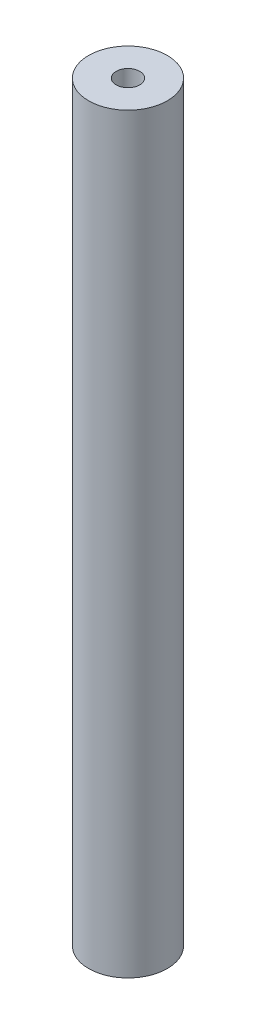
ISO-10303-21;
HEADER;
FILE_DESCRIPTION(('STEP AP214'),'2;1');
FILE_NAME('part.step','',(''),(''),'','','');
FILE_SCHEMA(('AUTOMOTIVE_DESIGN { 1 0 10303 214 1 1 1 1 }'));
ENDSEC;
DATA;
#1=APPLICATION_CONTEXT('core data for automotive mechanical design processes');
#2=APPLICATION_PROTOCOL_DEFINITION('international standard','automotive_design',2000,#1);
#3=PRODUCT_CONTEXT('',#1,'mechanical');
#4=PRODUCT('Part','Part','',(#3));
#5=PRODUCT_RELATED_PRODUCT_CATEGORY('part','',(#4));
#6=PRODUCT_DEFINITION_FORMATION('','',#4);
#7=PRODUCT_DEFINITION_CONTEXT('part definition',#1,'design');
#8=PRODUCT_DEFINITION('design','',#6,#7);
#9=PRODUCT_DEFINITION_SHAPE('','',#8);
#10=(LENGTH_UNIT() NAMED_UNIT(*) SI_UNIT(.MILLI.,.METRE.));
#11=(NAMED_UNIT(*) PLANE_ANGLE_UNIT() SI_UNIT($,.RADIAN.));
#12=(NAMED_UNIT(*) SI_UNIT($,.STERADIAN.) SOLID_ANGLE_UNIT());
#13=UNCERTAINTY_MEASURE_WITH_UNIT(LENGTH_MEASURE(1.E-05),#10,'distance_accuracy_value','');
#14=(GEOMETRIC_REPRESENTATION_CONTEXT(3) GLOBAL_UNCERTAINTY_ASSIGNED_CONTEXT((#13)) GLOBAL_UNIT_ASSIGNED_CONTEXT((#10,
#11,#12)) REPRESENTATION_CONTEXT('',''));
#15=CARTESIAN_POINT('',(0.,0.,0.));
#16=DIRECTION('',(0.,0.,1.));
#17=DIRECTION('',(1.,0.,0.));
#18=AXIS2_PLACEMENT_3D('',#15,#16,#17);
#19=CARTESIAN_POINT('',(0.,57.33,0.));
#20=DIRECTION('',(0.,1.,0.));
#21=DIRECTION('',(0.,0.,1.));
#22=AXIS2_PLACEMENT_3D('',#19,#20,#21);
#23=PLANE('',#22);
#24=CARTESIAN_POINT('',(0.,57.33,0.));
#25=DIRECTION('',(0.,1.,0.));
#26=DIRECTION('',(0.,0.,1.));
#27=AXIS2_PLACEMENT_3D('',#24,#25,#26);
#28=CIRCLE('',#27,3.);
#29=CARTESIAN_POINT('',(0.,57.33,3.));
#30=VERTEX_POINT('',#29);
#31=EDGE_CURVE('E10',#30,#30,#28,.T.);
#32=ORIENTED_EDGE('',*,*,#31,.T.);
#33=EDGE_LOOP('',(#32));
#34=FACE_BOUND('',#33,.T.);
#35=CARTESIAN_POINT('',(0.,57.33,0.));
#36=DIRECTION('',(0.,1.,0.));
#37=DIRECTION('',(0.,0.,1.));
#38=AXIS2_PLACEMENT_3D('',#35,#36,#37);
#39=CIRCLE('',#38,0.9);
#40=CARTESIAN_POINT('',(0.,57.33,0.9));
#41=VERTEX_POINT('',#40);
#42=EDGE_CURVE('E42',#41,#41,#39,.T.);
#43=ORIENTED_EDGE('',*,*,#42,.F.);
#44=EDGE_LOOP('',(#43));
#45=FACE_BOUND('',#44,.T.);
#46=ADVANCED_FACE('F31',(#34,#45),#23,.T.);
#47=CARTESIAN_POINT('',(0.,0.,0.));
#48=DIRECTION('',(0.,1.,0.));
#49=DIRECTION('',(0.,0.,1.));
#50=AXIS2_PLACEMENT_3D('',#47,#48,#49);
#51=PLANE('',#50);
#52=CARTESIAN_POINT('',(0.,0.,0.));
#53=DIRECTION('',(0.,1.,0.));
#54=DIRECTION('',(0.,0.,1.));
#55=AXIS2_PLACEMENT_3D('',#52,#53,#54);
#56=CIRCLE('',#55,3.);
#57=CARTESIAN_POINT('',(0.,0.,3.));
#58=VERTEX_POINT('',#57);
#59=EDGE_CURVE('E35',#58,#58,#56,.T.);
#60=ORIENTED_EDGE('',*,*,#59,.F.);
#61=EDGE_LOOP('',(#60));
#62=FACE_BOUND('',#61,.T.);
#63=CARTESIAN_POINT('',(0.,0.,0.));
#64=DIRECTION('',(0.,1.,0.));
#65=DIRECTION('',(0.,0.,1.));
#66=AXIS2_PLACEMENT_3D('',#63,#64,#65);
#67=CIRCLE('',#66,0.9);
#68=CARTESIAN_POINT('',(0.,0.,0.9));
#69=VERTEX_POINT('',#68);
#70=EDGE_CURVE('E44',#69,#69,#67,.T.);
#71=ORIENTED_EDGE('',*,*,#70,.T.);
#72=EDGE_LOOP('',(#71));
#73=FACE_BOUND('',#72,.T.);
#74=ADVANCED_FACE('F54',(#62,#73),#51,.F.);
#75=CARTESIAN_POINT('',(0.,57.33,0.));
#76=DIRECTION('',(0.,-1.,0.));
#77=DIRECTION('',(0.,0.,-1.));
#78=AXIS2_PLACEMENT_3D('',#75,#76,#77);
#79=CYLINDRICAL_SURFACE('',#78,3.);
#80=ORIENTED_EDGE('',*,*,#31,.F.);
#81=EDGE_LOOP('',(#80));
#82=FACE_BOUND('',#81,.T.);
#83=ORIENTED_EDGE('',*,*,#59,.T.);
#84=EDGE_LOOP('',(#83));
#85=FACE_BOUND('',#84,.T.);
#86=ADVANCED_FACE('F33',(#82,#85),#79,.T.);
#87=CARTESIAN_POINT('',(0.,57.33,0.));
#88=DIRECTION('',(0.,-1.,0.));
#89=DIRECTION('',(0.,0.,-1.));
#90=AXIS2_PLACEMENT_3D('',#87,#88,#89);
#91=CYLINDRICAL_SURFACE('',#90,0.9);
#92=ORIENTED_EDGE('',*,*,#42,.T.);
#93=EDGE_LOOP('',(#92));
#94=FACE_BOUND('',#93,.T.);
#95=ORIENTED_EDGE('',*,*,#70,.F.);
#96=EDGE_LOOP('',(#95));
#97=FACE_BOUND('',#96,.T.);
#98=ADVANCED_FACE('F50',(#94,#97),#91,.F.);
#99=CLOSED_SHELL('',(#46,#74,#86,#98));
#100=MANIFOLD_SOLID_BREP('B2',#99);
#101=ADVANCED_BREP_SHAPE_REPRESENTATION('',(#18,#100),#14);
#102=SHAPE_DEFINITION_REPRESENTATION(#9,#101);
ENDSEC;
END-ISO-10303-21;
